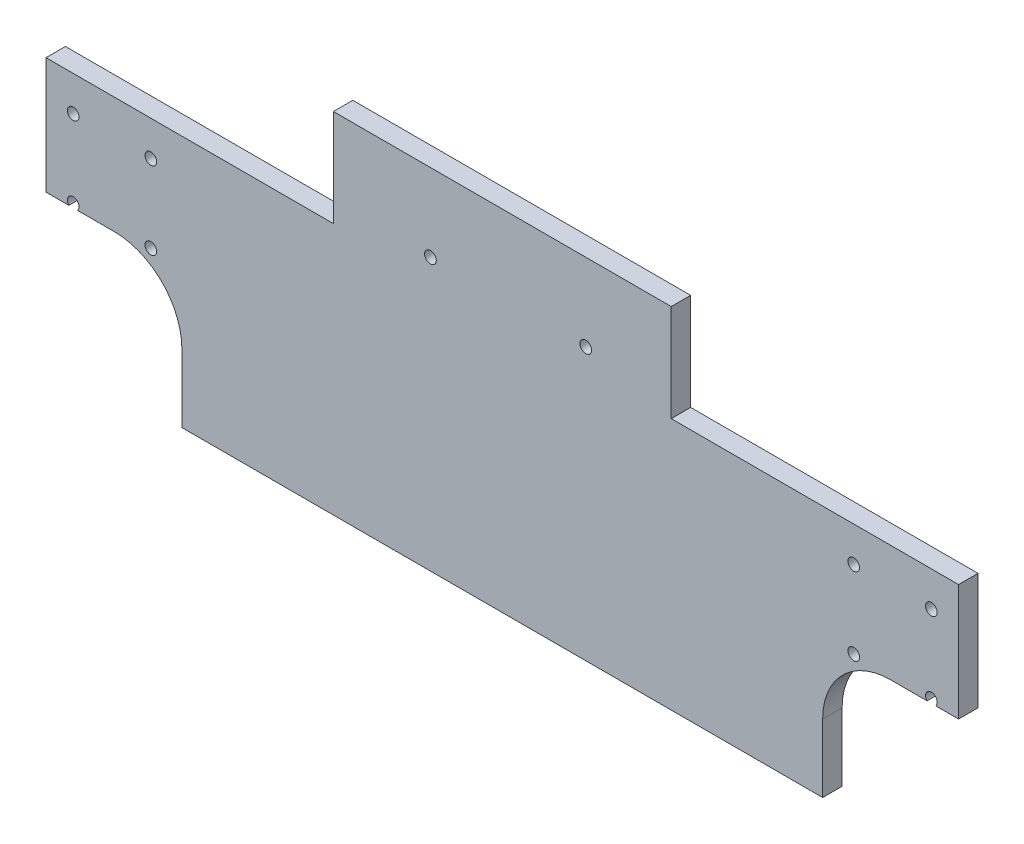
ISO-10303-21;
HEADER;
FILE_DESCRIPTION(('STEP AP214'),'2;1');
FILE_NAME('part.step','',(''),(''),'','','');
FILE_SCHEMA(('AUTOMOTIVE_DESIGN { 1 0 10303 214 1 1 1 1 }'));
ENDSEC;
DATA;
#1=APPLICATION_CONTEXT('core data for automotive mechanical design processes');
#2=APPLICATION_PROTOCOL_DEFINITION('international standard','automotive_design',2000,#1);
#3=PRODUCT_CONTEXT('',#1,'mechanical');
#4=PRODUCT('Part','Part','',(#3));
#5=PRODUCT_RELATED_PRODUCT_CATEGORY('part','',(#4));
#6=PRODUCT_DEFINITION_FORMATION('','',#4);
#7=PRODUCT_DEFINITION_CONTEXT('part definition',#1,'design');
#8=PRODUCT_DEFINITION('design','',#6,#7);
#9=PRODUCT_DEFINITION_SHAPE('','',#8);
#10=(LENGTH_UNIT() NAMED_UNIT(*) SI_UNIT(.MILLI.,.METRE.));
#11=(NAMED_UNIT(*) PLANE_ANGLE_UNIT() SI_UNIT($,.RADIAN.));
#12=(NAMED_UNIT(*) SI_UNIT($,.STERADIAN.) SOLID_ANGLE_UNIT());
#13=UNCERTAINTY_MEASURE_WITH_UNIT(LENGTH_MEASURE(1.E-05),#10,'distance_accuracy_value','');
#14=(GEOMETRIC_REPRESENTATION_CONTEXT(3) GLOBAL_UNCERTAINTY_ASSIGNED_CONTEXT((#13)) GLOBAL_UNIT_ASSIGNED_CONTEXT((#10,
#11,#12)) REPRESENTATION_CONTEXT('',''));
#15=CARTESIAN_POINT('',(0.,0.,0.));
#16=DIRECTION('',(0.,0.,1.));
#17=DIRECTION('',(1.,0.,0.));
#18=AXIS2_PLACEMENT_3D('',#15,#16,#17);
#19=CARTESIAN_POINT('',(228.,36.,5.));
#20=DIRECTION('',(0.,0.,-1.));
#21=DIRECTION('',(-1.,0.,0.));
#22=AXIS2_PLACEMENT_3D('',#19,#20,#21);
#23=CYLINDRICAL_SURFACE('',#22,1.5);
#24=CARTESIAN_POINT('',(228.,36.,0.));
#25=DIRECTION('',(0.,0.,1.));
#26=DIRECTION('',(1.,0.,0.));
#27=AXIS2_PLACEMENT_3D('',#24,#25,#26);
#28=CIRCLE('',#27,1.5);
#29=CARTESIAN_POINT('',(229.11803398875,35.,0.));
#30=VERTEX_POINT('',#29);
#31=CARTESIAN_POINT('',(226.88196601125,35.,0.));
#32=VERTEX_POINT('',#31);
#33=EDGE_CURVE('E214',#30,#32,#28,.T.);
#34=ORIENTED_EDGE('',*,*,#33,.F.);
#35=DIRECTION('',(0.,0.,-1.));
#36=VECTOR('',#35,1.);
#37=CARTESIAN_POINT('',(229.11803398875,35.,5.));
#38=LINE('',#37,#36);
#39=CARTESIAN_POINT('',(229.11803398875,35.,5.));
#40=VERTEX_POINT('',#39);
#41=EDGE_CURVE('E11',#40,#30,#38,.T.);
#42=ORIENTED_EDGE('',*,*,#41,.F.);
#43=CARTESIAN_POINT('',(228.,36.,5.));
#44=DIRECTION('',(0.,0.,1.));
#45=DIRECTION('',(1.,0.,0.));
#46=AXIS2_PLACEMENT_3D('',#43,#44,#45);
#47=CIRCLE('',#46,1.5);
#48=CARTESIAN_POINT('',(226.88196601125,35.,5.));
#49=VERTEX_POINT('',#48);
#50=EDGE_CURVE('E460',#40,#49,#47,.T.);
#51=ORIENTED_EDGE('',*,*,#50,.T.);
#52=DIRECTION('',(0.,0.,-1.));
#53=VECTOR('',#52,1.);
#54=CARTESIAN_POINT('',(226.88196601125,35.,5.));
#55=LINE('',#54,#53);
#56=EDGE_CURVE('E52',#49,#32,#55,.T.);
#57=ORIENTED_EDGE('',*,*,#56,.T.);
#58=EDGE_LOOP('',(#34,#42,#51,#57));
#59=FACE_BOUND('',#58,.T.);
#60=ADVANCED_FACE('F35',(#59),#23,.F.);
#61=CARTESIAN_POINT('',(0.,35.,5.));
#62=DIRECTION('',(0.,-1.,0.));
#63=DIRECTION('',(0.,0.,-1.));
#64=AXIS2_PLACEMENT_3D('',#61,#62,#63);
#65=PLANE('',#64);
#66=DIRECTION('',(-1.,0.,0.));
#67=VECTOR('',#66,1.);
#68=CARTESIAN_POINT('',(0.,35.,0.));
#69=LINE('',#68,#67);
#70=CARTESIAN_POINT('',(235.,35.,0.));
#71=VERTEX_POINT('',#70);
#72=EDGE_CURVE('E216',#71,#30,#69,.T.);
#73=ORIENTED_EDGE('',*,*,#72,.F.);
#74=DIRECTION('',(0.,0.,-1.));
#75=VECTOR('',#74,1.);
#76=CARTESIAN_POINT('',(235.,35.,5.));
#77=LINE('',#76,#75);
#78=CARTESIAN_POINT('',(235.,35.,5.));
#79=VERTEX_POINT('',#78);
#80=EDGE_CURVE('E44',#79,#71,#77,.T.);
#81=ORIENTED_EDGE('',*,*,#80,.F.);
#82=DIRECTION('',(-1.,0.,0.));
#83=VECTOR('',#82,1.);
#84=CARTESIAN_POINT('',(0.,35.,5.));
#85=LINE('',#84,#83);
#86=EDGE_CURVE('E188',#79,#40,#85,.T.);
#87=ORIENTED_EDGE('',*,*,#86,.T.);
#88=ORIENTED_EDGE('',*,*,#41,.T.);
#89=EDGE_LOOP('',(#73,#81,#87,#88));
#90=FACE_BOUND('',#89,.T.);
#91=ADVANCED_FACE('F326',(#90),#65,.T.);
#92=CARTESIAN_POINT('',(235.,0.,5.));
#93=DIRECTION('',(-1.,0.,0.));
#94=DIRECTION('',(0.,0.,1.));
#95=AXIS2_PLACEMENT_3D('',#92,#93,#94);
#96=PLANE('',#95);
#97=DIRECTION('',(0.,1.,0.));
#98=VECTOR('',#97,1.);
#99=CARTESIAN_POINT('',(235.,0.,0.));
#100=LINE('',#99,#98);
#101=CARTESIAN_POINT('',(235.,65.,0.));
#102=VERTEX_POINT('',#101);
#103=EDGE_CURVE('E219',#71,#102,#100,.T.);
#104=ORIENTED_EDGE('',*,*,#103,.T.);
#105=DIRECTION('',(0.,0.,-1.));
#106=VECTOR('',#105,1.);
#107=CARTESIAN_POINT('',(235.,65.,5.));
#108=LINE('',#107,#106);
#109=CARTESIAN_POINT('',(235.,65.,5.));
#110=VERTEX_POINT('',#109);
#111=EDGE_CURVE('E310',#110,#102,#108,.T.);
#112=ORIENTED_EDGE('',*,*,#111,.F.);
#113=DIRECTION('',(0.,1.,0.));
#114=VECTOR('',#113,1.);
#115=CARTESIAN_POINT('',(235.,0.,5.));
#116=LINE('',#115,#114);
#117=EDGE_CURVE('E318',#79,#110,#116,.T.);
#118=ORIENTED_EDGE('',*,*,#117,.F.);
#119=ORIENTED_EDGE('',*,*,#80,.T.);
#120=EDGE_LOOP('',(#104,#112,#118,#119));
#121=FACE_BOUND('',#120,.T.);
#122=ADVANCED_FACE('F315',(#121),#96,.F.);
#123=CARTESIAN_POINT('',(0.,65.,5.));
#124=DIRECTION('',(0.,-1.,0.));
#125=DIRECTION('',(1.,0.,0.));
#126=AXIS2_PLACEMENT_3D('',#123,#124,#125);
#127=PLANE('',#126);
#128=DIRECTION('',(-1.,0.,0.));
#129=VECTOR('',#128,1.);
#130=CARTESIAN_POINT('',(0.,65.,0.));
#131=LINE('',#130,#129);
#132=CARTESIAN_POINT('',(161.,65.,0.));
#133=VERTEX_POINT('',#132);
#134=EDGE_CURVE('E223',#102,#133,#131,.T.);
#135=ORIENTED_EDGE('',*,*,#134,.T.);
#136=DIRECTION('',(0.,0.,-1.));
#137=VECTOR('',#136,1.);
#138=CARTESIAN_POINT('',(161.,65.,5.));
#139=LINE('',#138,#137);
#140=CARTESIAN_POINT('',(161.,65.,5.));
#141=VERTEX_POINT('',#140);
#142=EDGE_CURVE('E307',#141,#133,#139,.T.);
#143=ORIENTED_EDGE('',*,*,#142,.F.);
#144=DIRECTION('',(-1.,0.,0.));
#145=VECTOR('',#144,1.);
#146=CARTESIAN_POINT('',(0.,65.,5.));
#147=LINE('',#146,#145);
#148=EDGE_CURVE('E465',#110,#141,#147,.T.);
#149=ORIENTED_EDGE('',*,*,#148,.F.);
#150=ORIENTED_EDGE('',*,*,#111,.T.);
#151=EDGE_LOOP('',(#135,#143,#149,#150));
#152=FACE_BOUND('',#151,.T.);
#153=ADVANCED_FACE('F350',(#152),#127,.F.);
#154=CARTESIAN_POINT('',(161.,0.,5.));
#155=DIRECTION('',(-1.,0.,0.));
#156=DIRECTION('',(0.,0.,1.));
#157=AXIS2_PLACEMENT_3D('',#154,#155,#156);
#158=PLANE('',#157);
#159=DIRECTION('',(0.,1.,0.));
#160=VECTOR('',#159,1.);
#161=CARTESIAN_POINT('',(161.,0.,0.));
#162=LINE('',#161,#160);
#163=CARTESIAN_POINT('',(161.,90.,0.));
#164=VERTEX_POINT('',#163);
#165=EDGE_CURVE('E226',#133,#164,#162,.T.);
#166=ORIENTED_EDGE('',*,*,#165,.T.);
#167=DIRECTION('',(0.,0.,-1.));
#168=VECTOR('',#167,1.);
#169=CARTESIAN_POINT('',(161.,90.,5.));
#170=LINE('',#169,#168);
#171=CARTESIAN_POINT('',(161.,90.,5.));
#172=VERTEX_POINT('',#171);
#173=EDGE_CURVE('E304',#172,#164,#170,.T.);
#174=ORIENTED_EDGE('',*,*,#173,.F.);
#175=DIRECTION('',(0.,1.,0.));
#176=VECTOR('',#175,1.);
#177=CARTESIAN_POINT('',(161.,0.,5.));
#178=LINE('',#177,#176);
#179=EDGE_CURVE('E468',#141,#172,#178,.T.);
#180=ORIENTED_EDGE('',*,*,#179,.F.);
#181=ORIENTED_EDGE('',*,*,#142,.T.);
#182=EDGE_LOOP('',(#166,#174,#180,#181));
#183=FACE_BOUND('',#182,.T.);
#184=ADVANCED_FACE('F353',(#183),#158,.F.);
#185=CARTESIAN_POINT('',(0.,90.,5.));
#186=DIRECTION('',(0.,-1.,0.));
#187=DIRECTION('',(1.,0.,0.));
#188=AXIS2_PLACEMENT_3D('',#185,#186,#187);
#189=PLANE('',#188);
#190=DIRECTION('',(-1.,0.,0.));
#191=VECTOR('',#190,1.);
#192=CARTESIAN_POINT('',(0.,90.,0.));
#193=LINE('',#192,#191);
#194=CARTESIAN_POINT('',(74.,90.,0.));
#195=VERTEX_POINT('',#194);
#196=EDGE_CURVE('E229',#164,#195,#193,.T.);
#197=ORIENTED_EDGE('',*,*,#196,.T.);
#198=DIRECTION('',(0.,0.,-1.));
#199=VECTOR('',#198,1.);
#200=CARTESIAN_POINT('',(74.,90.,5.));
#201=LINE('',#200,#199);
#202=CARTESIAN_POINT('',(74.,90.,5.));
#203=VERTEX_POINT('',#202);
#204=EDGE_CURVE('E301',#203,#195,#201,.T.);
#205=ORIENTED_EDGE('',*,*,#204,.F.);
#206=DIRECTION('',(-1.,0.,0.));
#207=VECTOR('',#206,1.);
#208=CARTESIAN_POINT('',(0.,90.,5.));
#209=LINE('',#208,#207);
#210=EDGE_CURVE('E471',#172,#203,#209,.T.);
#211=ORIENTED_EDGE('',*,*,#210,.F.);
#212=ORIENTED_EDGE('',*,*,#173,.T.);
#213=EDGE_LOOP('',(#197,#205,#211,#212));
#214=FACE_BOUND('',#213,.T.);
#215=ADVANCED_FACE('F357',(#214),#189,.F.);
#216=CARTESIAN_POINT('',(74.,0.,5.));
#217=DIRECTION('',(1.,0.,0.));
#218=DIRECTION('',(0.,0.,-1.));
#219=AXIS2_PLACEMENT_3D('',#216,#217,#218);
#220=PLANE('',#219);
#221=DIRECTION('',(0.,-1.,0.));
#222=VECTOR('',#221,1.);
#223=CARTESIAN_POINT('',(74.,0.,0.));
#224=LINE('',#223,#222);
#225=CARTESIAN_POINT('',(74.,65.,0.));
#226=VERTEX_POINT('',#225);
#227=EDGE_CURVE('E232',#195,#226,#224,.T.);
#228=ORIENTED_EDGE('',*,*,#227,.T.);
#229=DIRECTION('',(0.,0.,-1.));
#230=VECTOR('',#229,1.);
#231=CARTESIAN_POINT('',(74.,65.,5.));
#232=LINE('',#231,#230);
#233=CARTESIAN_POINT('',(74.,65.,5.));
#234=VERTEX_POINT('',#233);
#235=EDGE_CURVE('E298',#234,#226,#232,.T.);
#236=ORIENTED_EDGE('',*,*,#235,.F.);
#237=DIRECTION('',(0.,-1.,0.));
#238=VECTOR('',#237,1.);
#239=CARTESIAN_POINT('',(74.,0.,5.));
#240=LINE('',#239,#238);
#241=EDGE_CURVE('E474',#203,#234,#240,.T.);
#242=ORIENTED_EDGE('',*,*,#241,.F.);
#243=ORIENTED_EDGE('',*,*,#204,.T.);
#244=EDGE_LOOP('',(#228,#236,#242,#243));
#245=FACE_BOUND('',#244,.T.);
#246=ADVANCED_FACE('F361',(#245),#220,.F.);
#247=CARTESIAN_POINT('',(0.,65.,5.));
#248=DIRECTION('',(0.,-1.,0.));
#249=DIRECTION('',(0.,0.,-1.));
#250=AXIS2_PLACEMENT_3D('',#247,#248,#249);
#251=PLANE('',#250);
#252=DIRECTION('',(-1.,0.,0.));
#253=VECTOR('',#252,1.);
#254=CARTESIAN_POINT('',(0.,65.,0.));
#255=LINE('',#254,#253);
#256=CARTESIAN_POINT('',(0.,65.,0.));
#257=VERTEX_POINT('',#256);
#258=EDGE_CURVE('E235',#226,#257,#255,.T.);
#259=ORIENTED_EDGE('',*,*,#258,.T.);
#260=DIRECTION('',(0.,0.,-1.));
#261=VECTOR('',#260,1.);
#262=CARTESIAN_POINT('',(0.,65.,5.));
#263=LINE('',#262,#261);
#264=CARTESIAN_POINT('',(0.,65.,5.));
#265=VERTEX_POINT('',#264);
#266=EDGE_CURVE('E295',#265,#257,#263,.T.);
#267=ORIENTED_EDGE('',*,*,#266,.F.);
#268=DIRECTION('',(-1.,0.,0.));
#269=VECTOR('',#268,1.);
#270=CARTESIAN_POINT('',(0.,65.,5.));
#271=LINE('',#270,#269);
#272=EDGE_CURVE('E477',#234,#265,#271,.T.);
#273=ORIENTED_EDGE('',*,*,#272,.F.);
#274=ORIENTED_EDGE('',*,*,#235,.T.);
#275=EDGE_LOOP('',(#259,#267,#273,#274));
#276=FACE_BOUND('',#275,.T.);
#277=ADVANCED_FACE('F365',(#276),#251,.F.);
#278=CARTESIAN_POINT('',(0.,0.,5.));
#279=DIRECTION('',(1.,0.,0.));
#280=DIRECTION('',(0.,1.,0.));
#281=AXIS2_PLACEMENT_3D('',#278,#279,#280);
#282=PLANE('',#281);
#283=DIRECTION('',(0.,-1.,0.));
#284=VECTOR('',#283,1.);
#285=CARTESIAN_POINT('',(0.,0.,0.));
#286=LINE('',#285,#284);
#287=CARTESIAN_POINT('',(0.,35.,0.));
#288=VERTEX_POINT('',#287);
#289=EDGE_CURVE('E238',#257,#288,#286,.T.);
#290=ORIENTED_EDGE('',*,*,#289,.T.);
#291=DIRECTION('',(0.,0.,-1.));
#292=VECTOR('',#291,1.);
#293=CARTESIAN_POINT('',(0.,35.,5.));
#294=LINE('',#293,#292);
#295=CARTESIAN_POINT('',(0.,35.,5.));
#296=VERTEX_POINT('',#295);
#297=EDGE_CURVE('E293',#296,#288,#294,.T.);
#298=ORIENTED_EDGE('',*,*,#297,.F.);
#299=DIRECTION('',(0.,-1.,0.));
#300=VECTOR('',#299,1.);
#301=CARTESIAN_POINT('',(0.,0.,5.));
#302=LINE('',#301,#300);
#303=EDGE_CURVE('E480',#265,#296,#302,.T.);
#304=ORIENTED_EDGE('',*,*,#303,.F.);
#305=ORIENTED_EDGE('',*,*,#266,.T.);
#306=EDGE_LOOP('',(#290,#298,#304,#305));
#307=FACE_BOUND('',#306,.T.);
#308=ADVANCED_FACE('F369',(#307),#282,.F.);
#309=CARTESIAN_POINT('',(0.,35.,5.));
#310=DIRECTION('',(0.,-1.,0.));
#311=DIRECTION('',(1.,0.,0.));
#312=AXIS2_PLACEMENT_3D('',#309,#310,#311);
#313=PLANE('',#312);
#314=DIRECTION('',(-1.,0.,0.));
#315=VECTOR('',#314,1.);
#316=CARTESIAN_POINT('',(0.,35.,0.));
#317=LINE('',#316,#315);
#318=CARTESIAN_POINT('',(5.8819660112501,35.,0.));
#319=VERTEX_POINT('',#318);
#320=EDGE_CURVE('E241',#319,#288,#317,.T.);
#321=ORIENTED_EDGE('',*,*,#320,.F.);
#322=DIRECTION('',(0.,0.,-1.));
#323=VECTOR('',#322,1.);
#324=CARTESIAN_POINT('',(5.8819660112501,35.,5.));
#325=LINE('',#324,#323);
#326=CARTESIAN_POINT('',(5.8819660112501,35.,5.));
#327=VERTEX_POINT('',#326);
#328=EDGE_CURVE('E291',#327,#319,#325,.T.);
#329=ORIENTED_EDGE('',*,*,#328,.F.);
#330=DIRECTION('',(-1.,0.,0.));
#331=VECTOR('',#330,1.);
#332=CARTESIAN_POINT('',(0.,35.,5.));
#333=LINE('',#332,#331);
#334=EDGE_CURVE('E482',#327,#296,#333,.T.);
#335=ORIENTED_EDGE('',*,*,#334,.T.);
#336=ORIENTED_EDGE('',*,*,#297,.T.);
#337=EDGE_LOOP('',(#321,#329,#335,#336));
#338=FACE_BOUND('',#337,.T.);
#339=ADVANCED_FACE('F373',(#338),#313,.T.);
#340=CARTESIAN_POINT('',(7.,36.,5.));
#341=DIRECTION('',(0.,0.,-1.));
#342=DIRECTION('',(-1.,0.,0.));
#343=AXIS2_PLACEMENT_3D('',#340,#341,#342);
#344=CYLINDRICAL_SURFACE('',#343,1.5);
#345=CARTESIAN_POINT('',(7.,36.,0.));
#346=DIRECTION('',(0.,0.,1.));
#347=DIRECTION('',(1.,0.,0.));
#348=AXIS2_PLACEMENT_3D('',#345,#346,#347);
#349=CIRCLE('',#348,1.5);
#350=CARTESIAN_POINT('',(8.11803398874991,35.,0.));
#351=VERTEX_POINT('',#350);
#352=EDGE_CURVE('E244',#351,#319,#349,.T.);
#353=ORIENTED_EDGE('',*,*,#352,.F.);
#354=DIRECTION('',(0.,0.,-1.));
#355=VECTOR('',#354,1.);
#356=CARTESIAN_POINT('',(8.11803398874991,35.,5.));
#357=LINE('',#356,#355);
#358=CARTESIAN_POINT('',(8.11803398874991,35.,5.));
#359=VERTEX_POINT('',#358);
#360=EDGE_CURVE('E289',#359,#351,#357,.T.);
#361=ORIENTED_EDGE('',*,*,#360,.F.);
#362=CARTESIAN_POINT('',(7.,36.,5.));
#363=DIRECTION('',(0.,0.,1.));
#364=DIRECTION('',(1.,0.,0.));
#365=AXIS2_PLACEMENT_3D('',#362,#363,#364);
#366=CIRCLE('',#365,1.5);
#367=EDGE_CURVE('E485',#359,#327,#366,.T.);
#368=ORIENTED_EDGE('',*,*,#367,.T.);
#369=ORIENTED_EDGE('',*,*,#328,.T.);
#370=EDGE_LOOP('',(#353,#361,#368,#369));
#371=FACE_BOUND('',#370,.T.);
#372=ADVANCED_FACE('F375',(#371),#344,.F.);
#373=CARTESIAN_POINT('',(17.5,35.,0.));
#374=VERTEX_POINT('',#373);
#375=EDGE_CURVE('E245',#374,#351,#317,.T.);
#376=ORIENTED_EDGE('',*,*,#375,.F.);
#377=DIRECTION('',(0.,0.,-1.));
#378=VECTOR('',#377,1.);
#379=CARTESIAN_POINT('',(17.5,35.,5.));
#380=LINE('',#379,#378);
#381=CARTESIAN_POINT('',(17.5,35.,5.));
#382=VERTEX_POINT('',#381);
#383=EDGE_CURVE('E287',#382,#374,#380,.T.);
#384=ORIENTED_EDGE('',*,*,#383,.F.);
#385=EDGE_CURVE('E486',#382,#359,#333,.T.);
#386=ORIENTED_EDGE('',*,*,#385,.T.);
#387=ORIENTED_EDGE('',*,*,#360,.T.);
#388=EDGE_LOOP('',(#376,#384,#386,#387));
#389=FACE_BOUND('',#388,.T.);
#390=ADVANCED_FACE('F378',(#389),#313,.T.);
#391=CARTESIAN_POINT('',(17.5,17.5,5.));
#392=DIRECTION('',(0.,0.,-1.));
#393=DIRECTION('',(-1.,0.,0.));
#394=AXIS2_PLACEMENT_3D('',#391,#392,#393);
#395=CYLINDRICAL_SURFACE('',#394,17.5);
#396=CARTESIAN_POINT('',(17.5,17.5,0.));
#397=DIRECTION('',(0.,0.,1.));
#398=DIRECTION('',(1.,0.,0.));
#399=AXIS2_PLACEMENT_3D('',#396,#397,#398);
#400=CIRCLE('',#399,17.5);
#401=CARTESIAN_POINT('',(35.,17.5,0.));
#402=VERTEX_POINT('',#401);
#403=EDGE_CURVE('E248',#402,#374,#400,.T.);
#404=ORIENTED_EDGE('',*,*,#403,.F.);
#405=DIRECTION('',(0.,0.,-1.));
#406=VECTOR('',#405,1.);
#407=CARTESIAN_POINT('',(35.,17.5,5.));
#408=LINE('',#407,#406);
#409=CARTESIAN_POINT('',(35.,17.5,5.));
#410=VERTEX_POINT('',#409);
#411=EDGE_CURVE('E285',#410,#402,#408,.T.);
#412=ORIENTED_EDGE('',*,*,#411,.F.);
#413=CARTESIAN_POINT('',(17.5,17.5,5.));
#414=DIRECTION('',(0.,0.,1.));
#415=DIRECTION('',(1.,0.,0.));
#416=AXIS2_PLACEMENT_3D('',#413,#414,#415);
#417=CIRCLE('',#416,17.5);
#418=EDGE_CURVE('E489',#410,#382,#417,.T.);
#419=ORIENTED_EDGE('',*,*,#418,.T.);
#420=ORIENTED_EDGE('',*,*,#383,.T.);
#421=EDGE_LOOP('',(#404,#412,#419,#420));
#422=FACE_BOUND('',#421,.T.);
#423=ADVANCED_FACE('F382',(#422),#395,.F.);
#424=CARTESIAN_POINT('',(35.,0.,5.));
#425=DIRECTION('',(1.,0.,0.));
#426=DIRECTION('',(0.,1.,0.));
#427=AXIS2_PLACEMENT_3D('',#424,#425,#426);
#428=PLANE('',#427);
#429=DIRECTION('',(0.,-1.,0.));
#430=VECTOR('',#429,1.);
#431=CARTESIAN_POINT('',(35.,0.,0.));
#432=LINE('',#431,#430);
#433=CARTESIAN_POINT('',(35.,0.,0.));
#434=VERTEX_POINT('',#433);
#435=EDGE_CURVE('E251',#402,#434,#432,.T.);
#436=ORIENTED_EDGE('',*,*,#435,.T.);
#437=DIRECTION('',(0.,0.,-1.));
#438=VECTOR('',#437,1.);
#439=CARTESIAN_POINT('',(35.,0.,5.));
#440=LINE('',#439,#438);
#441=CARTESIAN_POINT('',(35.,0.,5.));
#442=VERTEX_POINT('',#441);
#443=EDGE_CURVE('E282',#442,#434,#440,.T.);
#444=ORIENTED_EDGE('',*,*,#443,.F.);
#445=DIRECTION('',(0.,-1.,0.));
#446=VECTOR('',#445,1.);
#447=CARTESIAN_POINT('',(35.,0.,5.));
#448=LINE('',#447,#446);
#449=EDGE_CURVE('E492',#410,#442,#448,.T.);
#450=ORIENTED_EDGE('',*,*,#449,.F.);
#451=ORIENTED_EDGE('',*,*,#411,.T.);
#452=EDGE_LOOP('',(#436,#444,#450,#451));
#453=FACE_BOUND('',#452,.T.);
#454=ADVANCED_FACE('F386',(#453),#428,.F.);
#455=CARTESIAN_POINT('',(0.,0.,5.));
#456=DIRECTION('',(0.,1.,0.));
#457=DIRECTION('',(0.,0.,1.));
#458=AXIS2_PLACEMENT_3D('',#455,#456,#457);
#459=PLANE('',#458);
#460=DIRECTION('',(1.,0.,0.));
#461=VECTOR('',#460,1.);
#462=CARTESIAN_POINT('',(0.,0.,0.));
#463=LINE('',#462,#461);
#464=CARTESIAN_POINT('',(200.,0.,0.));
#465=VERTEX_POINT('',#464);
#466=EDGE_CURVE('E254',#434,#465,#463,.T.);
#467=ORIENTED_EDGE('',*,*,#466,.T.);
#468=DIRECTION('',(0.,0.,-1.));
#469=VECTOR('',#468,1.);
#470=CARTESIAN_POINT('',(200.,0.,5.));
#471=LINE('',#470,#469);
#472=CARTESIAN_POINT('',(200.,0.,5.));
#473=VERTEX_POINT('',#472);
#474=EDGE_CURVE('E171',#473,#465,#471,.T.);
#475=ORIENTED_EDGE('',*,*,#474,.F.);
#476=DIRECTION('',(1.,0.,0.));
#477=VECTOR('',#476,1.);
#478=CARTESIAN_POINT('',(0.,0.,5.));
#479=LINE('',#478,#477);
#480=EDGE_CURVE('E180',#442,#473,#479,.T.);
#481=ORIENTED_EDGE('',*,*,#480,.F.);
#482=ORIENTED_EDGE('',*,*,#443,.T.);
#483=EDGE_LOOP('',(#467,#475,#481,#482));
#484=FACE_BOUND('',#483,.T.);
#485=ADVANCED_FACE('F390',(#484),#459,.F.);
#486=CARTESIAN_POINT('',(200.,-3.1720657846433E-13,5.));
#487=DIRECTION('',(1.,0.,0.));
#488=DIRECTION('',(0.,1.,0.));
#489=AXIS2_PLACEMENT_3D('',#486,#487,#488);
#490=PLANE('',#489);
#491=DIRECTION('',(0.,-1.,0.));
#492=VECTOR('',#491,1.);
#493=CARTESIAN_POINT('',(200.,-3.1720657846433E-13,0.));
#494=LINE('',#493,#492);
#495=CARTESIAN_POINT('',(200.,17.5,0.));
#496=VERTEX_POINT('',#495);
#497=EDGE_CURVE('E167',#496,#465,#494,.T.);
#498=ORIENTED_EDGE('',*,*,#497,.F.);
#499=DIRECTION('',(0.,0.,-1.));
#500=VECTOR('',#499,1.);
#501=CARTESIAN_POINT('',(200.,17.5,5.));
#502=LINE('',#501,#500);
#503=CARTESIAN_POINT('',(200.,17.5,5.));
#504=VERTEX_POINT('',#503);
#505=EDGE_CURVE('E162',#504,#496,#502,.T.);
#506=ORIENTED_EDGE('',*,*,#505,.F.);
#507=DIRECTION('',(0.,-1.,0.));
#508=VECTOR('',#507,1.);
#509=CARTESIAN_POINT('',(200.,-3.1720657846433E-13,5.));
#510=LINE('',#509,#508);
#511=EDGE_CURVE('E165',#504,#473,#510,.T.);
#512=ORIENTED_EDGE('',*,*,#511,.T.);
#513=ORIENTED_EDGE('',*,*,#474,.T.);
#514=EDGE_LOOP('',(#498,#506,#512,#513));
#515=FACE_BOUND('',#514,.T.);
#516=ADVANCED_FACE('F164',(#515),#490,.T.);
#517=CARTESIAN_POINT('',(217.5,17.5,5.));
#518=DIRECTION('',(0.,0.,-1.));
#519=DIRECTION('',(-1.,0.,0.));
#520=AXIS2_PLACEMENT_3D('',#517,#518,#519);
#521=CYLINDRICAL_SURFACE('',#520,17.5);
#522=CARTESIAN_POINT('',(217.5,17.5,0.));
#523=DIRECTION('',(0.,0.,1.));
#524=DIRECTION('',(1.,0.,0.));
#525=AXIS2_PLACEMENT_3D('',#522,#523,#524);
#526=CIRCLE('',#525,17.5);
#527=CARTESIAN_POINT('',(217.5,35.,0.));
#528=VERTEX_POINT('',#527);
#529=EDGE_CURVE('E258',#528,#496,#526,.T.);
#530=ORIENTED_EDGE('',*,*,#529,.F.);
#531=DIRECTION('',(0.,0.,-1.));
#532=VECTOR('',#531,1.);
#533=CARTESIAN_POINT('',(217.5,35.,5.));
#534=LINE('',#533,#532);
#535=CARTESIAN_POINT('',(217.5,35.,5.));
#536=VERTEX_POINT('',#535);
#537=EDGE_CURVE('E107',#536,#528,#534,.T.);
#538=ORIENTED_EDGE('',*,*,#537,.F.);
#539=CARTESIAN_POINT('',(217.5,17.5,5.));
#540=DIRECTION('',(0.,0.,1.));
#541=DIRECTION('',(1.,0.,0.));
#542=AXIS2_PLACEMENT_3D('',#539,#540,#541);
#543=CIRCLE('',#542,17.5);
#544=EDGE_CURVE('E178',#536,#504,#543,.T.);
#545=ORIENTED_EDGE('',*,*,#544,.T.);
#546=ORIENTED_EDGE('',*,*,#505,.T.);
#547=EDGE_LOOP('',(#530,#538,#545,#546));
#548=FACE_BOUND('',#547,.T.);
#549=ADVANCED_FACE('F183',(#548),#521,.F.);
#550=CARTESIAN_POINT('',(27.,56.,5.));
#551=DIRECTION('',(0.,0.,-1.));
#552=DIRECTION('',(-1.,0.,0.));
#553=AXIS2_PLACEMENT_3D('',#550,#551,#552);
#554=CYLINDRICAL_SURFACE('',#553,1.5);
#555=CARTESIAN_POINT('',(27.,56.,5.));
#556=DIRECTION('',(0.,0.,1.));
#557=DIRECTION('',(1.,0.,0.));
#558=AXIS2_PLACEMENT_3D('',#555,#556,#557);
#559=CIRCLE('',#558,1.5);
#560=CARTESIAN_POINT('',(28.5,56.,5.));
#561=VERTEX_POINT('',#560);
#562=EDGE_CURVE('E202',#561,#561,#559,.T.);
#563=ORIENTED_EDGE('',*,*,#562,.T.);
#564=EDGE_LOOP('',(#563));
#565=FACE_BOUND('',#564,.T.);
#566=CARTESIAN_POINT('',(27.,56.,0.));
#567=DIRECTION('',(0.,0.,1.));
#568=DIRECTION('',(1.,0.,0.));
#569=AXIS2_PLACEMENT_3D('',#566,#567,#568);
#570=CIRCLE('',#569,1.5);
#571=CARTESIAN_POINT('',(28.5,56.,0.));
#572=VERTEX_POINT('',#571);
#573=EDGE_CURVE('E272',#572,#572,#570,.T.);
#574=ORIENTED_EDGE('',*,*,#573,.F.);
#575=EDGE_LOOP('',(#574));
#576=FACE_BOUND('',#575,.T.);
#577=ADVANCED_FACE('F397',(#565,#576),#554,.F.);
#578=CARTESIAN_POINT('',(27.,36.,5.));
#579=DIRECTION('',(0.,0.,-1.));
#580=DIRECTION('',(-1.,0.,0.));
#581=AXIS2_PLACEMENT_3D('',#578,#579,#580);
#582=CYLINDRICAL_SURFACE('',#581,1.5);
#583=CARTESIAN_POINT('',(27.,36.,5.));
#584=DIRECTION('',(0.,0.,1.));
#585=DIRECTION('',(1.,0.,0.));
#586=AXIS2_PLACEMENT_3D('',#583,#584,#585);
#587=CIRCLE('',#586,1.5);
#588=CARTESIAN_POINT('',(28.5,36.,5.));
#589=VERTEX_POINT('',#588);
#590=EDGE_CURVE('E199',#589,#589,#587,.T.);
#591=ORIENTED_EDGE('',*,*,#590,.T.);
#592=EDGE_LOOP('',(#591));
#593=FACE_BOUND('',#592,.T.);
#594=CARTESIAN_POINT('',(27.,36.,0.));
#595=DIRECTION('',(0.,0.,1.));
#596=DIRECTION('',(1.,0.,0.));
#597=AXIS2_PLACEMENT_3D('',#594,#595,#596);
#598=CIRCLE('',#597,1.5);
#599=CARTESIAN_POINT('',(28.5,36.,0.));
#600=VERTEX_POINT('',#599);
#601=EDGE_CURVE('E269',#600,#600,#598,.T.);
#602=ORIENTED_EDGE('',*,*,#601,.F.);
#603=EDGE_LOOP('',(#602));
#604=FACE_BOUND('',#603,.T.);
#605=ADVANCED_FACE('F401',(#593,#604),#582,.F.);
#606=CARTESIAN_POINT('',(208.,56.,5.));
#607=DIRECTION('',(0.,0.,-1.));
#608=DIRECTION('',(-1.,0.,0.));
#609=AXIS2_PLACEMENT_3D('',#606,#607,#608);
#610=CYLINDRICAL_SURFACE('',#609,1.5);
#611=CARTESIAN_POINT('',(208.,56.,5.));
#612=DIRECTION('',(0.,0.,1.));
#613=DIRECTION('',(1.,0.,0.));
#614=AXIS2_PLACEMENT_3D('',#611,#612,#613);
#615=CIRCLE('',#614,1.5);
#616=CARTESIAN_POINT('',(209.5,56.,5.));
#617=VERTEX_POINT('',#616);
#618=EDGE_CURVE('E196',#617,#617,#615,.T.);
#619=ORIENTED_EDGE('',*,*,#618,.T.);
#620=EDGE_LOOP('',(#619));
#621=FACE_BOUND('',#620,.T.);
#622=CARTESIAN_POINT('',(208.,56.,0.));
#623=DIRECTION('',(0.,0.,1.));
#624=DIRECTION('',(1.,0.,0.));
#625=AXIS2_PLACEMENT_3D('',#622,#623,#624);
#626=CIRCLE('',#625,1.5);
#627=CARTESIAN_POINT('',(209.5,56.,0.));
#628=VERTEX_POINT('',#627);
#629=EDGE_CURVE('E266',#628,#628,#626,.T.);
#630=ORIENTED_EDGE('',*,*,#629,.F.);
#631=EDGE_LOOP('',(#630));
#632=FACE_BOUND('',#631,.T.);
#633=ADVANCED_FACE('F407',(#621,#632),#610,.F.);
#634=CARTESIAN_POINT('',(228.,56.,5.));
#635=DIRECTION('',(0.,0.,-1.));
#636=DIRECTION('',(-1.,0.,0.));
#637=AXIS2_PLACEMENT_3D('',#634,#635,#636);
#638=CYLINDRICAL_SURFACE('',#637,1.5);
#639=CARTESIAN_POINT('',(228.,56.,5.));
#640=DIRECTION('',(0.,0.,1.));
#641=DIRECTION('',(1.,0.,0.));
#642=AXIS2_PLACEMENT_3D('',#639,#640,#641);
#643=CIRCLE('',#642,1.5);
#644=CARTESIAN_POINT('',(229.5,56.,5.));
#645=VERTEX_POINT('',#644);
#646=EDGE_CURVE('E193',#645,#645,#643,.T.);
#647=ORIENTED_EDGE('',*,*,#646,.T.);
#648=EDGE_LOOP('',(#647));
#649=FACE_BOUND('',#648,.T.);
#650=CARTESIAN_POINT('',(228.,56.,0.));
#651=DIRECTION('',(0.,0.,1.));
#652=DIRECTION('',(1.,0.,0.));
#653=AXIS2_PLACEMENT_3D('',#650,#651,#652);
#654=CIRCLE('',#653,1.5);
#655=CARTESIAN_POINT('',(229.5,56.,0.));
#656=VERTEX_POINT('',#655);
#657=EDGE_CURVE('E263',#656,#656,#654,.T.);
#658=ORIENTED_EDGE('',*,*,#657,.F.);
#659=EDGE_LOOP('',(#658));
#660=FACE_BOUND('',#659,.T.);
#661=ADVANCED_FACE('F338',(#649,#660),#638,.F.);
#662=CARTESIAN_POINT('',(208.,36.,5.));
#663=DIRECTION('',(0.,0.,-1.));
#664=DIRECTION('',(-1.,0.,0.));
#665=AXIS2_PLACEMENT_3D('',#662,#663,#664);
#666=CYLINDRICAL_SURFACE('',#665,1.5);
#667=CARTESIAN_POINT('',(208.,36.,5.));
#668=DIRECTION('',(0.,0.,1.));
#669=DIRECTION('',(1.,0.,0.));
#670=AXIS2_PLACEMENT_3D('',#667,#668,#669);
#671=CIRCLE('',#670,1.5);
#672=CARTESIAN_POINT('',(209.5,36.,5.));
#673=VERTEX_POINT('',#672);
#674=EDGE_CURVE('E186',#673,#673,#671,.T.);
#675=ORIENTED_EDGE('',*,*,#674,.T.);
#676=EDGE_LOOP('',(#675));
#677=FACE_BOUND('',#676,.T.);
#678=CARTESIAN_POINT('',(208.,36.,0.));
#679=DIRECTION('',(0.,0.,1.));
#680=DIRECTION('',(1.,0.,0.));
#681=AXIS2_PLACEMENT_3D('',#678,#679,#680);
#682=CIRCLE('',#681,1.5);
#683=CARTESIAN_POINT('',(209.5,36.,0.));
#684=VERTEX_POINT('',#683);
#685=EDGE_CURVE('E260',#684,#684,#682,.T.);
#686=ORIENTED_EDGE('',*,*,#685,.F.);
#687=EDGE_LOOP('',(#686));
#688=FACE_BOUND('',#687,.T.);
#689=ADVANCED_FACE('F331',(#677,#688),#666,.F.);
#690=EDGE_CURVE('E220',#32,#528,#69,.T.);
#691=ORIENTED_EDGE('',*,*,#690,.F.);
#692=ORIENTED_EDGE('',*,*,#56,.F.);
#693=EDGE_CURVE('E184',#49,#536,#85,.T.);
#694=ORIENTED_EDGE('',*,*,#693,.T.);
#695=ORIENTED_EDGE('',*,*,#537,.T.);
#696=EDGE_LOOP('',(#691,#692,#694,#695));
#697=FACE_BOUND('',#696,.T.);
#698=ADVANCED_FACE('F328',(#697),#65,.T.);
#699=CARTESIAN_POINT('',(99.,70.,5.));
#700=DIRECTION('',(0.,0.,-1.));
#701=DIRECTION('',(-1.,0.,0.));
#702=AXIS2_PLACEMENT_3D('',#699,#700,#701);
#703=CYLINDRICAL_SURFACE('',#702,1.5);
#704=CARTESIAN_POINT('',(99.,70.,5.));
#705=DIRECTION('',(0.,0.,1.));
#706=DIRECTION('',(1.,0.,0.));
#707=AXIS2_PLACEMENT_3D('',#704,#705,#706);
#708=CIRCLE('',#707,1.5);
#709=CARTESIAN_POINT('',(100.5,70.,5.));
#710=VERTEX_POINT('',#709);
#711=EDGE_CURVE('E457',#710,#710,#708,.T.);
#712=ORIENTED_EDGE('',*,*,#711,.T.);
#713=EDGE_LOOP('',(#712));
#714=FACE_BOUND('',#713,.T.);
#715=CARTESIAN_POINT('',(99.,70.,0.));
#716=DIRECTION('',(0.,0.,1.));
#717=DIRECTION('',(1.,0.,0.));
#718=AXIS2_PLACEMENT_3D('',#715,#716,#717);
#719=CIRCLE('',#718,1.5);
#720=CARTESIAN_POINT('',(100.5,70.,0.));
#721=VERTEX_POINT('',#720);
#722=EDGE_CURVE('E211',#721,#721,#719,.T.);
#723=ORIENTED_EDGE('',*,*,#722,.F.);
#724=EDGE_LOOP('',(#723));
#725=FACE_BOUND('',#724,.T.);
#726=ADVANCED_FACE('F330',(#714,#725),#703,.F.);
#727=CARTESIAN_POINT('',(139.,70.,5.));
#728=DIRECTION('',(0.,0.,-1.));
#729=DIRECTION('',(-1.,0.,0.));
#730=AXIS2_PLACEMENT_3D('',#727,#728,#729);
#731=CYLINDRICAL_SURFACE('',#730,1.5);
#732=CARTESIAN_POINT('',(139.,70.,5.));
#733=DIRECTION('',(0.,0.,1.));
#734=DIRECTION('',(1.,0.,0.));
#735=AXIS2_PLACEMENT_3D('',#732,#733,#734);
#736=CIRCLE('',#735,1.5);
#737=CARTESIAN_POINT('',(140.5,70.,5.));
#738=VERTEX_POINT('',#737);
#739=EDGE_CURVE('E278',#738,#738,#736,.T.);
#740=ORIENTED_EDGE('',*,*,#739,.T.);
#741=EDGE_LOOP('',(#740));
#742=FACE_BOUND('',#741,.T.);
#743=CARTESIAN_POINT('',(139.,70.,0.));
#744=DIRECTION('',(0.,0.,1.));
#745=DIRECTION('',(1.,0.,0.));
#746=AXIS2_PLACEMENT_3D('',#743,#744,#745);
#747=CIRCLE('',#746,1.5);
#748=CARTESIAN_POINT('',(140.5,70.,0.));
#749=VERTEX_POINT('',#748);
#750=EDGE_CURVE('E208',#749,#749,#747,.T.);
#751=ORIENTED_EDGE('',*,*,#750,.F.);
#752=EDGE_LOOP('',(#751));
#753=FACE_BOUND('',#752,.T.);
#754=ADVANCED_FACE('F37',(#742,#753),#731,.F.);
#755=CARTESIAN_POINT('',(7.,56.,5.));
#756=DIRECTION('',(0.,0.,-1.));
#757=DIRECTION('',(-1.,0.,0.));
#758=AXIS2_PLACEMENT_3D('',#755,#756,#757);
#759=CYLINDRICAL_SURFACE('',#758,1.5);
#760=CARTESIAN_POINT('',(7.,56.,5.));
#761=DIRECTION('',(0.,0.,1.));
#762=DIRECTION('',(1.,0.,0.));
#763=AXIS2_PLACEMENT_3D('',#760,#761,#762);
#764=CIRCLE('',#763,1.5);
#765=CARTESIAN_POINT('',(8.5,56.,5.));
#766=VERTEX_POINT('',#765);
#767=EDGE_CURVE('E205',#766,#766,#764,.T.);
#768=ORIENTED_EDGE('',*,*,#767,.T.);
#769=EDGE_LOOP('',(#768));
#770=FACE_BOUND('',#769,.T.);
#771=CARTESIAN_POINT('',(7.,56.,0.));
#772=DIRECTION('',(0.,0.,1.));
#773=DIRECTION('',(1.,0.,0.));
#774=AXIS2_PLACEMENT_3D('',#771,#772,#773);
#775=CIRCLE('',#774,1.5);
#776=CARTESIAN_POINT('',(8.5,56.,0.));
#777=VERTEX_POINT('',#776);
#778=EDGE_CURVE('E275',#777,#777,#775,.T.);
#779=ORIENTED_EDGE('',*,*,#778,.F.);
#780=EDGE_LOOP('',(#779));
#781=FACE_BOUND('',#780,.T.);
#782=ADVANCED_FACE('F412',(#770,#781),#759,.F.);
#783=CARTESIAN_POINT('',(0.,0.,5.));
#784=DIRECTION('',(0.,0.,1.));
#785=DIRECTION('',(1.,0.,0.));
#786=AXIS2_PLACEMENT_3D('',#783,#784,#785);
#787=PLANE('',#786);
#788=ORIENTED_EDGE('',*,*,#739,.F.);
#789=EDGE_LOOP('',(#788));
#790=FACE_BOUND('',#789,.T.);
#791=ORIENTED_EDGE('',*,*,#711,.F.);
#792=EDGE_LOOP('',(#791));
#793=FACE_BOUND('',#792,.T.);
#794=ORIENTED_EDGE('',*,*,#50,.F.);
#795=ORIENTED_EDGE('',*,*,#86,.F.);
#796=ORIENTED_EDGE('',*,*,#117,.T.);
#797=ORIENTED_EDGE('',*,*,#148,.T.);
#798=ORIENTED_EDGE('',*,*,#179,.T.);
#799=ORIENTED_EDGE('',*,*,#210,.T.);
#800=ORIENTED_EDGE('',*,*,#241,.T.);
#801=ORIENTED_EDGE('',*,*,#272,.T.);
#802=ORIENTED_EDGE('',*,*,#303,.T.);
#803=ORIENTED_EDGE('',*,*,#334,.F.);
#804=ORIENTED_EDGE('',*,*,#367,.F.);
#805=ORIENTED_EDGE('',*,*,#385,.F.);
#806=ORIENTED_EDGE('',*,*,#418,.F.);
#807=ORIENTED_EDGE('',*,*,#449,.T.);
#808=ORIENTED_EDGE('',*,*,#480,.T.);
#809=ORIENTED_EDGE('',*,*,#511,.F.);
#810=ORIENTED_EDGE('',*,*,#544,.F.);
#811=ORIENTED_EDGE('',*,*,#693,.F.);
#812=EDGE_LOOP('',(#794,#795,#796,#797,#798,#799,#800,#801,#802,#803,#804,#805,#806,#807,#808,
#809,#810,#811));
#813=FACE_BOUND('',#812,.T.);
#814=ORIENTED_EDGE('',*,*,#674,.F.);
#815=EDGE_LOOP('',(#814));
#816=FACE_BOUND('',#815,.T.);
#817=ORIENTED_EDGE('',*,*,#646,.F.);
#818=EDGE_LOOP('',(#817));
#819=FACE_BOUND('',#818,.T.);
#820=ORIENTED_EDGE('',*,*,#618,.F.);
#821=EDGE_LOOP('',(#820));
#822=FACE_BOUND('',#821,.T.);
#823=ORIENTED_EDGE('',*,*,#590,.F.);
#824=EDGE_LOOP('',(#823));
#825=FACE_BOUND('',#824,.T.);
#826=ORIENTED_EDGE('',*,*,#562,.F.);
#827=EDGE_LOOP('',(#826));
#828=FACE_BOUND('',#827,.T.);
#829=ORIENTED_EDGE('',*,*,#767,.F.);
#830=EDGE_LOOP('',(#829));
#831=FACE_BOUND('',#830,.T.);
#832=ADVANCED_FACE('F175',(#790,#793,#813,#816,#819,#822,#825,#828,#831),#787,.T.);
#833=CARTESIAN_POINT('',(0.,0.,0.));
#834=DIRECTION('',(0.,0.,1.));
#835=DIRECTION('',(1.,0.,0.));
#836=AXIS2_PLACEMENT_3D('',#833,#834,#835);
#837=PLANE('',#836);
#838=ORIENTED_EDGE('',*,*,#750,.T.);
#839=EDGE_LOOP('',(#838));
#840=FACE_BOUND('',#839,.T.);
#841=ORIENTED_EDGE('',*,*,#722,.T.);
#842=EDGE_LOOP('',(#841));
#843=FACE_BOUND('',#842,.T.);
#844=ORIENTED_EDGE('',*,*,#33,.T.);
#845=ORIENTED_EDGE('',*,*,#690,.T.);
#846=ORIENTED_EDGE('',*,*,#529,.T.);
#847=ORIENTED_EDGE('',*,*,#497,.T.);
#848=ORIENTED_EDGE('',*,*,#466,.F.);
#849=ORIENTED_EDGE('',*,*,#435,.F.);
#850=ORIENTED_EDGE('',*,*,#403,.T.);
#851=ORIENTED_EDGE('',*,*,#375,.T.);
#852=ORIENTED_EDGE('',*,*,#352,.T.);
#853=ORIENTED_EDGE('',*,*,#320,.T.);
#854=ORIENTED_EDGE('',*,*,#289,.F.);
#855=ORIENTED_EDGE('',*,*,#258,.F.);
#856=ORIENTED_EDGE('',*,*,#227,.F.);
#857=ORIENTED_EDGE('',*,*,#196,.F.);
#858=ORIENTED_EDGE('',*,*,#165,.F.);
#859=ORIENTED_EDGE('',*,*,#134,.F.);
#860=ORIENTED_EDGE('',*,*,#103,.F.);
#861=ORIENTED_EDGE('',*,*,#72,.T.);
#862=EDGE_LOOP('',(#844,#845,#846,#847,#848,#849,#850,#851,#852,#853,#854,#855,#856,#857,#858,
#859,#860,#861));
#863=FACE_BOUND('',#862,.T.);
#864=ORIENTED_EDGE('',*,*,#685,.T.);
#865=EDGE_LOOP('',(#864));
#866=FACE_BOUND('',#865,.T.);
#867=ORIENTED_EDGE('',*,*,#657,.T.);
#868=EDGE_LOOP('',(#867));
#869=FACE_BOUND('',#868,.T.);
#870=ORIENTED_EDGE('',*,*,#629,.T.);
#871=EDGE_LOOP('',(#870));
#872=FACE_BOUND('',#871,.T.);
#873=ORIENTED_EDGE('',*,*,#601,.T.);
#874=EDGE_LOOP('',(#873));
#875=FACE_BOUND('',#874,.T.);
#876=ORIENTED_EDGE('',*,*,#573,.T.);
#877=EDGE_LOOP('',(#876));
#878=FACE_BOUND('',#877,.T.);
#879=ORIENTED_EDGE('',*,*,#778,.T.);
#880=EDGE_LOOP('',(#879));
#881=FACE_BOUND('',#880,.T.);
#882=ADVANCED_FACE('F324',(#840,#843,#863,#866,#869,#872,#875,#878,#881),#837,.F.);
#883=CLOSED_SHELL('',(#60,#91,#122,#153,#184,#215,#246,#277,#308,#339,#372,#390,#423,#454,#485,
#516,#549,#577,#605,#633,#661,#689,#698,#726,#754,#782,#832,#882));
#884=MANIFOLD_SOLID_BREP('B2',#883);
#885=ADVANCED_BREP_SHAPE_REPRESENTATION('',(#18,#884),#14);
#886=SHAPE_DEFINITION_REPRESENTATION(#9,#885);
ENDSEC;
END-ISO-10303-21;
